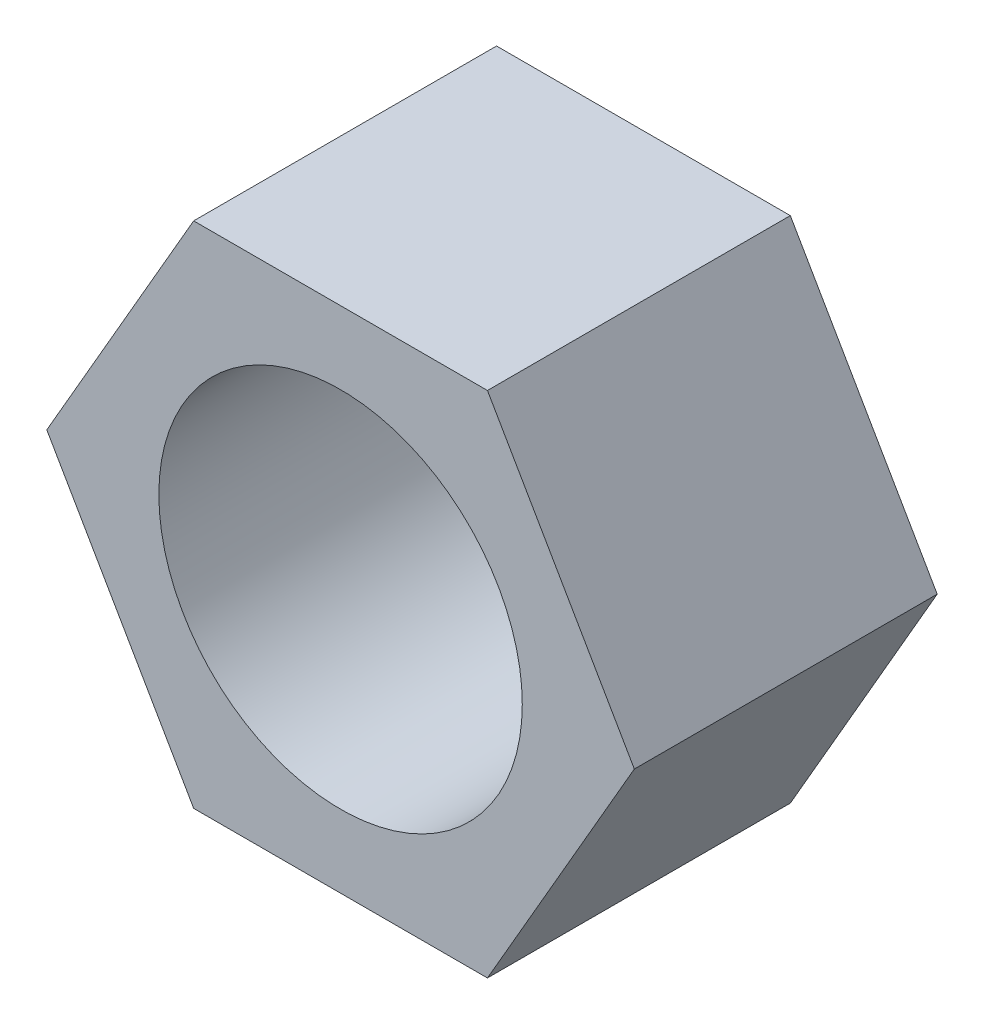
ISO-10303-21;
HEADER;
FILE_DESCRIPTION(('STEP AP214'),'2;1');
FILE_NAME('part.step','',(''),(''),'','','');
FILE_SCHEMA(('AUTOMOTIVE_DESIGN { 1 0 10303 214 1 1 1 1 }'));
ENDSEC;
DATA;
#1=APPLICATION_CONTEXT('core data for automotive mechanical design processes');
#2=APPLICATION_PROTOCOL_DEFINITION('international standard','automotive_design',2000,#1);
#3=PRODUCT_CONTEXT('',#1,'mechanical');
#4=PRODUCT('Part','Part','',(#3));
#5=PRODUCT_RELATED_PRODUCT_CATEGORY('part','',(#4));
#6=PRODUCT_DEFINITION_FORMATION('','',#4);
#7=PRODUCT_DEFINITION_CONTEXT('part definition',#1,'design');
#8=PRODUCT_DEFINITION('design','',#6,#7);
#9=PRODUCT_DEFINITION_SHAPE('','',#8);
#10=(LENGTH_UNIT() NAMED_UNIT(*) SI_UNIT(.MILLI.,.METRE.));
#11=(NAMED_UNIT(*) PLANE_ANGLE_UNIT() SI_UNIT($,.RADIAN.));
#12=(NAMED_UNIT(*) SI_UNIT($,.STERADIAN.) SOLID_ANGLE_UNIT());
#13=UNCERTAINTY_MEASURE_WITH_UNIT(LENGTH_MEASURE(1.E-05),#10,'distance_accuracy_value','');
#14=(GEOMETRIC_REPRESENTATION_CONTEXT(3) GLOBAL_UNCERTAINTY_ASSIGNED_CONTEXT((#13)) GLOBAL_UNIT_ASSIGNED_CONTEXT((#10,
#11,#12)) REPRESENTATION_CONTEXT('',''));
#15=CARTESIAN_POINT('',(0.,0.,0.));
#16=DIRECTION('',(0.,0.,1.));
#17=DIRECTION('',(1.,0.,0.));
#18=AXIS2_PLACEMENT_3D('',#15,#16,#17);
#19=CARTESIAN_POINT('',(0.,0.,2.5));
#20=DIRECTION('',(0.,0.,1.));
#21=DIRECTION('',(1.,0.,0.));
#22=AXIS2_PLACEMENT_3D('',#19,#20,#21);
#23=PLANE('',#22);
#24=DIRECTION('',(0.5,0.866025403784439,0.));
#25=VECTOR('',#24,1.);
#26=CARTESIAN_POINT('',(17.9767779409557,9.51162223861203,2.5));
#27=LINE('',#26,#25);
#28=CARTESIAN_POINT('',(17.9767779409557,9.51162223861203,2.5));
#29=VERTEX_POINT('',#28);
#30=CARTESIAN_POINT('',(19.1892135062539,11.611622238612,2.5));
#31=VERTEX_POINT('',#30);
#32=EDGE_CURVE('E129',#29,#31,#27,.T.);
#33=ORIENTED_EDGE('',*,*,#32,.T.);
#34=DIRECTION('',(-0.5,0.866025403784439,0.));
#35=VECTOR('',#34,1.);
#36=CARTESIAN_POINT('',(19.1892135062539,11.611622238612,2.5));
#37=LINE('',#36,#35);
#38=CARTESIAN_POINT('',(17.9767779409557,13.711622238612,2.5));
#39=VERTEX_POINT('',#38);
#40=EDGE_CURVE('E87',#31,#39,#37,.T.);
#41=ORIENTED_EDGE('',*,*,#40,.T.);
#42=DIRECTION('',(-1.,0.,0.));
#43=VECTOR('',#42,1.);
#44=CARTESIAN_POINT('',(17.9767779409557,13.711622238612,2.5));
#45=LINE('',#44,#43);
#46=CARTESIAN_POINT('',(15.5519068103593,13.711622238612,2.5));
#47=VERTEX_POINT('',#46);
#48=EDGE_CURVE('E100',#39,#47,#45,.T.);
#49=ORIENTED_EDGE('',*,*,#48,.T.);
#50=DIRECTION('',(-0.5,-0.866025403784439,0.));
#51=VECTOR('',#50,1.);
#52=CARTESIAN_POINT('',(15.5519068103593,13.711622238612,2.5));
#53=LINE('',#52,#51);
#54=CARTESIAN_POINT('',(14.3394712450611,11.611622238612,2.5));
#55=VERTEX_POINT('',#54);
#56=EDGE_CURVE('E94',#47,#55,#53,.T.);
#57=ORIENTED_EDGE('',*,*,#56,.T.);
#58=DIRECTION('',(0.499999999999999,-0.866025403784439,0.));
#59=VECTOR('',#58,1.);
#60=CARTESIAN_POINT('',(14.3394712450611,11.611622238612,2.5));
#61=LINE('',#60,#59);
#62=CARTESIAN_POINT('',(15.5519068103593,9.51162223861203,2.5));
#63=VERTEX_POINT('',#62);
#64=EDGE_CURVE('E98',#55,#63,#61,.T.);
#65=ORIENTED_EDGE('',*,*,#64,.T.);
#66=DIRECTION('',(1.,0.,0.));
#67=VECTOR('',#66,1.);
#68=CARTESIAN_POINT('',(15.5519068103593,9.51162223861203,2.5));
#69=LINE('',#68,#67);
#70=EDGE_CURVE('E50',#63,#29,#69,.T.);
#71=ORIENTED_EDGE('',*,*,#70,.T.);
#72=EDGE_LOOP('',(#33,#41,#49,#57,#65,#71));
#73=FACE_BOUND('',#72,.T.);
#74=CARTESIAN_POINT('',(16.7643423756575,11.611622238612,2.5));
#75=DIRECTION('',(0.,0.,1.));
#76=DIRECTION('',(1.,0.,0.));
#77=AXIS2_PLACEMENT_3D('',#74,#75,#76);
#78=CIRCLE('',#77,1.5);
#79=CARTESIAN_POINT('',(18.2643423756575,11.611622238612,2.5));
#80=VERTEX_POINT('',#79);
#81=EDGE_CURVE('E122',#80,#80,#78,.T.);
#82=ORIENTED_EDGE('',*,*,#81,.F.);
#83=EDGE_LOOP('',(#82));
#84=FACE_BOUND('',#83,.T.);
#85=ADVANCED_FACE('F33',(#73,#84),#23,.T.);
#86=CARTESIAN_POINT('',(0.,0.,0.));
#87=DIRECTION('',(0.,0.,1.));
#88=DIRECTION('',(1.,0.,0.));
#89=AXIS2_PLACEMENT_3D('',#86,#87,#88);
#90=PLANE('',#89);
#91=DIRECTION('',(0.5,0.866025403784439,0.));
#92=VECTOR('',#91,1.);
#93=CARTESIAN_POINT('',(17.9767779409557,9.51162223861203,0.));
#94=LINE('',#93,#92);
#95=CARTESIAN_POINT('',(17.9767779409557,9.51162223861203,0.));
#96=VERTEX_POINT('',#95);
#97=CARTESIAN_POINT('',(19.1892135062539,11.611622238612,0.));
#98=VERTEX_POINT('',#97);
#99=EDGE_CURVE('E118',#96,#98,#94,.T.);
#100=ORIENTED_EDGE('',*,*,#99,.F.);
#101=DIRECTION('',(1.,0.,0.));
#102=VECTOR('',#101,1.);
#103=CARTESIAN_POINT('',(15.5519068103593,9.51162223861203,0.));
#104=LINE('',#103,#102);
#105=CARTESIAN_POINT('',(15.5519068103593,9.51162223861203,0.));
#106=VERTEX_POINT('',#105);
#107=EDGE_CURVE('E79',#106,#96,#104,.T.);
#108=ORIENTED_EDGE('',*,*,#107,.F.);
#109=DIRECTION('',(0.499999999999999,-0.866025403784439,0.));
#110=VECTOR('',#109,1.);
#111=CARTESIAN_POINT('',(14.3394712450611,11.611622238612,0.));
#112=LINE('',#111,#110);
#113=CARTESIAN_POINT('',(14.3394712450611,11.611622238612,0.));
#114=VERTEX_POINT('',#113);
#115=EDGE_CURVE('E73',#114,#106,#112,.T.);
#116=ORIENTED_EDGE('',*,*,#115,.F.);
#117=DIRECTION('',(-0.5,-0.866025403784439,0.));
#118=VECTOR('',#117,1.);
#119=CARTESIAN_POINT('',(15.5519068103593,13.711622238612,0.));
#120=LINE('',#119,#118);
#121=CARTESIAN_POINT('',(15.5519068103593,13.711622238612,0.));
#122=VERTEX_POINT('',#121);
#123=EDGE_CURVE('E108',#122,#114,#120,.T.);
#124=ORIENTED_EDGE('',*,*,#123,.F.);
#125=DIRECTION('',(-1.,0.,0.));
#126=VECTOR('',#125,1.);
#127=CARTESIAN_POINT('',(17.9767779409557,13.711622238612,0.));
#128=LINE('',#127,#126);
#129=CARTESIAN_POINT('',(17.9767779409557,13.711622238612,0.));
#130=VERTEX_POINT('',#129);
#131=EDGE_CURVE('E124',#130,#122,#128,.T.);
#132=ORIENTED_EDGE('',*,*,#131,.F.);
#133=DIRECTION('',(-0.5,0.866025403784439,0.));
#134=VECTOR('',#133,1.);
#135=CARTESIAN_POINT('',(19.1892135062539,11.611622238612,0.));
#136=LINE('',#135,#134);
#137=EDGE_CURVE('E121',#98,#130,#136,.T.);
#138=ORIENTED_EDGE('',*,*,#137,.F.);
#139=EDGE_LOOP('',(#100,#108,#116,#124,#132,#138));
#140=FACE_BOUND('',#139,.T.);
#141=CARTESIAN_POINT('',(16.7643423756575,11.611622238612,0.));
#142=DIRECTION('',(0.,0.,1.));
#143=DIRECTION('',(1.,0.,0.));
#144=AXIS2_PLACEMENT_3D('',#141,#142,#143);
#145=CIRCLE('',#144,1.5);
#146=CARTESIAN_POINT('',(18.2643423756575,11.611622238612,0.));
#147=VERTEX_POINT('',#146);
#148=EDGE_CURVE('E222',#147,#147,#145,.T.);
#149=ORIENTED_EDGE('',*,*,#148,.T.);
#150=EDGE_LOOP('',(#149));
#151=FACE_BOUND('',#150,.T.);
#152=ADVANCED_FACE('F138',(#140,#151),#90,.F.);
#153=CARTESIAN_POINT('',(17.9767779409557,9.51162223861203,2.5));
#154=DIRECTION('',(-0.866025403784439,0.5,0.));
#155=DIRECTION('',(-0.5,-0.866025403784439,0.));
#156=AXIS2_PLACEMENT_3D('',#153,#154,#155);
#157=PLANE('',#156);
#158=ORIENTED_EDGE('',*,*,#99,.T.);
#159=DIRECTION('',(0.,0.,-1.));
#160=VECTOR('',#159,1.);
#161=CARTESIAN_POINT('',(19.1892135062539,11.611622238612,2.5));
#162=LINE('',#161,#160);
#163=EDGE_CURVE('E11',#31,#98,#162,.T.);
#164=ORIENTED_EDGE('',*,*,#163,.F.);
#165=ORIENTED_EDGE('',*,*,#32,.F.);
#166=DIRECTION('',(0.,0.,-1.));
#167=VECTOR('',#166,1.);
#168=CARTESIAN_POINT('',(17.9767779409557,9.51162223861203,2.5));
#169=LINE('',#168,#167);
#170=EDGE_CURVE('E114',#29,#96,#169,.T.);
#171=ORIENTED_EDGE('',*,*,#170,.T.);
#172=EDGE_LOOP('',(#158,#164,#165,#171));
#173=FACE_BOUND('',#172,.T.);
#174=ADVANCED_FACE('F35',(#173),#157,.F.);
#175=CARTESIAN_POINT('',(19.1892135062539,11.611622238612,2.5));
#176=DIRECTION('',(-0.866025403784439,-0.5,0.));
#177=DIRECTION('',(0.5,-0.866025403784439,0.));
#178=AXIS2_PLACEMENT_3D('',#175,#176,#177);
#179=PLANE('',#178);
#180=ORIENTED_EDGE('',*,*,#137,.T.);
#181=DIRECTION('',(0.,0.,-1.));
#182=VECTOR('',#181,1.);
#183=CARTESIAN_POINT('',(17.9767779409557,13.711622238612,2.5));
#184=LINE('',#183,#182);
#185=EDGE_CURVE('E42',#39,#130,#184,.T.);
#186=ORIENTED_EDGE('',*,*,#185,.F.);
#187=ORIENTED_EDGE('',*,*,#40,.F.);
#188=ORIENTED_EDGE('',*,*,#163,.T.);
#189=EDGE_LOOP('',(#180,#186,#187,#188));
#190=FACE_BOUND('',#189,.T.);
#191=ADVANCED_FACE('F163',(#190),#179,.F.);
#192=CARTESIAN_POINT('',(17.9767779409557,13.711622238612,2.5));
#193=DIRECTION('',(0.,-1.,0.));
#194=DIRECTION('',(0.,0.,-1.));
#195=AXIS2_PLACEMENT_3D('',#192,#193,#194);
#196=PLANE('',#195);
#197=ORIENTED_EDGE('',*,*,#131,.T.);
#198=DIRECTION('',(0.,0.,-1.));
#199=VECTOR('',#198,1.);
#200=CARTESIAN_POINT('',(15.5519068103593,13.711622238612,2.5));
#201=LINE('',#200,#199);
#202=EDGE_CURVE('E109',#47,#122,#201,.T.);
#203=ORIENTED_EDGE('',*,*,#202,.F.);
#204=ORIENTED_EDGE('',*,*,#48,.F.);
#205=ORIENTED_EDGE('',*,*,#185,.T.);
#206=EDGE_LOOP('',(#197,#203,#204,#205));
#207=FACE_BOUND('',#206,.T.);
#208=ADVANCED_FACE('F135',(#207),#196,.F.);
#209=CARTESIAN_POINT('',(15.5519068103593,13.711622238612,2.5));
#210=DIRECTION('',(0.866025403784439,-0.5,0.));
#211=DIRECTION('',(0.5,0.866025403784439,0.));
#212=AXIS2_PLACEMENT_3D('',#209,#210,#211);
#213=PLANE('',#212);
#214=ORIENTED_EDGE('',*,*,#123,.T.);
#215=DIRECTION('',(0.,0.,-1.));
#216=VECTOR('',#215,1.);
#217=CARTESIAN_POINT('',(14.3394712450611,11.611622238612,2.5));
#218=LINE('',#217,#216);
#219=EDGE_CURVE('E105',#55,#114,#218,.T.);
#220=ORIENTED_EDGE('',*,*,#219,.F.);
#221=ORIENTED_EDGE('',*,*,#56,.F.);
#222=ORIENTED_EDGE('',*,*,#202,.T.);
#223=EDGE_LOOP('',(#214,#220,#221,#222));
#224=FACE_BOUND('',#223,.T.);
#225=ADVANCED_FACE('F106',(#224),#213,.F.);
#226=CARTESIAN_POINT('',(14.3394712450611,11.611622238612,2.5));
#227=DIRECTION('',(0.866025403784439,0.5,0.));
#228=DIRECTION('',(-0.5,0.866025403784439,0.));
#229=AXIS2_PLACEMENT_3D('',#226,#227,#228);
#230=PLANE('',#229);
#231=ORIENTED_EDGE('',*,*,#115,.T.);
#232=DIRECTION('',(0.,0.,-1.));
#233=VECTOR('',#232,1.);
#234=CARTESIAN_POINT('',(15.5519068103593,9.51162223861203,2.5));
#235=LINE('',#234,#233);
#236=EDGE_CURVE('E110',#63,#106,#235,.T.);
#237=ORIENTED_EDGE('',*,*,#236,.F.);
#238=ORIENTED_EDGE('',*,*,#64,.F.);
#239=ORIENTED_EDGE('',*,*,#219,.T.);
#240=EDGE_LOOP('',(#231,#237,#238,#239));
#241=FACE_BOUND('',#240,.T.);
#242=ADVANCED_FACE('F112',(#241),#230,.F.);
#243=CARTESIAN_POINT('',(15.5519068103593,9.51162223861203,2.5));
#244=DIRECTION('',(0.,1.,0.));
#245=DIRECTION('',(0.,0.,1.));
#246=AXIS2_PLACEMENT_3D('',#243,#244,#245);
#247=PLANE('',#246);
#248=ORIENTED_EDGE('',*,*,#107,.T.);
#249=ORIENTED_EDGE('',*,*,#170,.F.);
#250=ORIENTED_EDGE('',*,*,#70,.F.);
#251=ORIENTED_EDGE('',*,*,#236,.T.);
#252=EDGE_LOOP('',(#248,#249,#250,#251));
#253=FACE_BOUND('',#252,.T.);
#254=ADVANCED_FACE('F143',(#253),#247,.F.);
#255=CARTESIAN_POINT('',(16.7643423756575,11.611622238612,2.5));
#256=DIRECTION('',(0.,0.,-1.));
#257=DIRECTION('',(-1.,0.,0.));
#258=AXIS2_PLACEMENT_3D('',#255,#256,#257);
#259=CYLINDRICAL_SURFACE('',#258,1.5);
#260=ORIENTED_EDGE('',*,*,#81,.T.);
#261=EDGE_LOOP('',(#260));
#262=FACE_BOUND('',#261,.T.);
#263=ORIENTED_EDGE('',*,*,#148,.F.);
#264=EDGE_LOOP('',(#263));
#265=FACE_BOUND('',#264,.T.);
#266=ADVANCED_FACE('F145',(#262,#265),#259,.F.);
#267=CLOSED_SHELL('',(#85,#152,#174,#191,#208,#225,#242,#254,#266));
#268=MANIFOLD_SOLID_BREP('B2',#267);
#269=ADVANCED_BREP_SHAPE_REPRESENTATION('',(#18,#268),#14);
#270=SHAPE_DEFINITION_REPRESENTATION(#9,#269);
ENDSEC;
END-ISO-10303-21;
